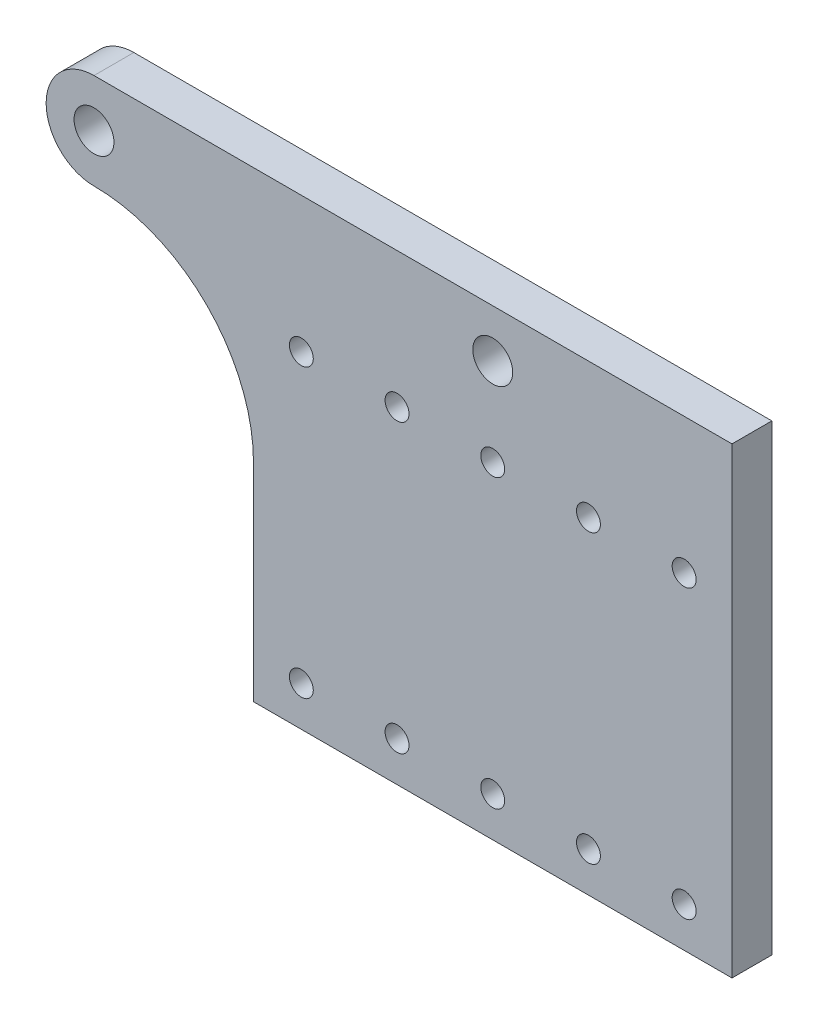
ISO-10303-21;
HEADER;
FILE_DESCRIPTION(('STEP AP214'),'2;1');
FILE_NAME('part.step','',(''),(''),'','','');
FILE_SCHEMA(('AUTOMOTIVE_DESIGN { 1 0 10303 214 1 1 1 1 }'));
ENDSEC;
DATA;
#1=APPLICATION_CONTEXT('core data for automotive mechanical design processes');
#2=APPLICATION_PROTOCOL_DEFINITION('international standard','automotive_design',2000,#1);
#3=PRODUCT_CONTEXT('',#1,'mechanical');
#4=PRODUCT('Part','Part','',(#3));
#5=PRODUCT_RELATED_PRODUCT_CATEGORY('part','',(#4));
#6=PRODUCT_DEFINITION_FORMATION('','',#4);
#7=PRODUCT_DEFINITION_CONTEXT('part definition',#1,'design');
#8=PRODUCT_DEFINITION('design','',#6,#7);
#9=PRODUCT_DEFINITION_SHAPE('','',#8);
#10=(LENGTH_UNIT() NAMED_UNIT(*) SI_UNIT(.MILLI.,.METRE.));
#11=(NAMED_UNIT(*) PLANE_ANGLE_UNIT() SI_UNIT($,.RADIAN.));
#12=(NAMED_UNIT(*) SI_UNIT($,.STERADIAN.) SOLID_ANGLE_UNIT());
#13=UNCERTAINTY_MEASURE_WITH_UNIT(LENGTH_MEASURE(1.E-05),#10,'distance_accuracy_value','');
#14=(GEOMETRIC_REPRESENTATION_CONTEXT(3) GLOBAL_UNCERTAINTY_ASSIGNED_CONTEXT((#13)) GLOBAL_UNIT_ASSIGNED_CONTEXT((#10,
#11,#12)) REPRESENTATION_CONTEXT('',''));
#15=CARTESIAN_POINT('',(0.,0.,0.));
#16=DIRECTION('',(0.,0.,1.));
#17=DIRECTION('',(1.,0.,0.));
#18=AXIS2_PLACEMENT_3D('',#15,#16,#17);
#19=CARTESIAN_POINT('',(24.,-41.,-0.00100000000000013));
#20=DIRECTION('',(0.,0.,1.));
#21=DIRECTION('',(1.,0.,0.));
#22=AXIS2_PLACEMENT_3D('',#19,#20,#21);
#23=CYLINDRICAL_SURFACE('',#22,1.5);
#24=CARTESIAN_POINT('',(24.,-41.,5.));
#25=DIRECTION('',(0.,0.,1.));
#26=DIRECTION('',(1.,0.,0.));
#27=AXIS2_PLACEMENT_3D('',#24,#25,#26);
#28=CIRCLE('',#27,1.5);
#29=CARTESIAN_POINT('',(25.5,-41.,5.));
#30=VERTEX_POINT('',#29);
#31=EDGE_CURVE('E169',#30,#30,#28,.T.);
#32=ORIENTED_EDGE('',*,*,#31,.T.);
#33=EDGE_LOOP('',(#32));
#34=FACE_BOUND('',#33,.T.);
#35=CARTESIAN_POINT('',(24.,-41.,0.));
#36=DIRECTION('',(0.,0.,1.));
#37=DIRECTION('',(1.,0.,0.));
#38=AXIS2_PLACEMENT_3D('',#35,#36,#37);
#39=CIRCLE('',#38,1.5);
#40=CARTESIAN_POINT('',(25.5,-41.,0.));
#41=VERTEX_POINT('',#40);
#42=EDGE_CURVE('E172',#41,#41,#39,.F.);
#43=ORIENTED_EDGE('',*,*,#42,.T.);
#44=EDGE_LOOP('',(#43));
#45=FACE_BOUND('',#44,.T.);
#46=ADVANCED_FACE('F38',(#34,#45),#23,.F.);
#47=CARTESIAN_POINT('',(12.,-41.,-0.00100000000000013));
#48=DIRECTION('',(0.,0.,1.));
#49=DIRECTION('',(1.,0.,0.));
#50=AXIS2_PLACEMENT_3D('',#47,#48,#49);
#51=CYLINDRICAL_SURFACE('',#50,1.5);
#52=CARTESIAN_POINT('',(12.,-41.,5.));
#53=DIRECTION('',(0.,0.,1.));
#54=DIRECTION('',(1.,0.,0.));
#55=AXIS2_PLACEMENT_3D('',#52,#53,#54);
#56=CIRCLE('',#55,1.5);
#57=CARTESIAN_POINT('',(13.5,-41.,5.));
#58=VERTEX_POINT('',#57);
#59=EDGE_CURVE('E163',#58,#58,#56,.T.);
#60=ORIENTED_EDGE('',*,*,#59,.T.);
#61=EDGE_LOOP('',(#60));
#62=FACE_BOUND('',#61,.T.);
#63=CARTESIAN_POINT('',(12.,-41.,0.));
#64=DIRECTION('',(0.,0.,1.));
#65=DIRECTION('',(1.,0.,0.));
#66=AXIS2_PLACEMENT_3D('',#63,#64,#65);
#67=CIRCLE('',#66,1.5);
#68=CARTESIAN_POINT('',(13.5,-41.,0.));
#69=VERTEX_POINT('',#68);
#70=EDGE_CURVE('E166',#69,#69,#67,.F.);
#71=ORIENTED_EDGE('',*,*,#70,.T.);
#72=EDGE_LOOP('',(#71));
#73=FACE_BOUND('',#72,.T.);
#74=ADVANCED_FACE('F203',(#62,#73),#51,.F.);
#75=CARTESIAN_POINT('',(0.,-41.,-0.00100000000000013));
#76=DIRECTION('',(0.,0.,1.));
#77=DIRECTION('',(1.,0.,0.));
#78=AXIS2_PLACEMENT_3D('',#75,#76,#77);
#79=CYLINDRICAL_SURFACE('',#78,1.5);
#80=CARTESIAN_POINT('',(0.,-41.,5.));
#81=DIRECTION('',(0.,0.,1.));
#82=DIRECTION('',(1.,0.,0.));
#83=AXIS2_PLACEMENT_3D('',#80,#81,#82);
#84=CIRCLE('',#83,1.5);
#85=CARTESIAN_POINT('',(1.49999999999999,-41.,5.));
#86=VERTEX_POINT('',#85);
#87=EDGE_CURVE('E157',#86,#86,#84,.T.);
#88=ORIENTED_EDGE('',*,*,#87,.T.);
#89=EDGE_LOOP('',(#88));
#90=FACE_BOUND('',#89,.T.);
#91=CARTESIAN_POINT('',(0.,-41.,0.));
#92=DIRECTION('',(0.,0.,1.));
#93=DIRECTION('',(1.,0.,0.));
#94=AXIS2_PLACEMENT_3D('',#91,#92,#93);
#95=CIRCLE('',#94,1.5);
#96=CARTESIAN_POINT('',(1.49999999999999,-41.,0.));
#97=VERTEX_POINT('',#96);
#98=EDGE_CURVE('E160',#97,#97,#95,.F.);
#99=ORIENTED_EDGE('',*,*,#98,.T.);
#100=EDGE_LOOP('',(#99));
#101=FACE_BOUND('',#100,.T.);
#102=ADVANCED_FACE('F208',(#90,#101),#79,.F.);
#103=CARTESIAN_POINT('',(24.,-5.,-0.00100000000000013));
#104=DIRECTION('',(0.,0.,1.));
#105=DIRECTION('',(1.,0.,0.));
#106=AXIS2_PLACEMENT_3D('',#103,#104,#105);
#107=CYLINDRICAL_SURFACE('',#106,1.5);
#108=CARTESIAN_POINT('',(24.,-5.,5.));
#109=DIRECTION('',(0.,0.,1.));
#110=DIRECTION('',(1.,0.,0.));
#111=AXIS2_PLACEMENT_3D('',#108,#109,#110);
#112=CIRCLE('',#111,1.5);
#113=CARTESIAN_POINT('',(25.5,-5.,5.));
#114=VERTEX_POINT('',#113);
#115=EDGE_CURVE('E151',#114,#114,#112,.T.);
#116=ORIENTED_EDGE('',*,*,#115,.T.);
#117=EDGE_LOOP('',(#116));
#118=FACE_BOUND('',#117,.T.);
#119=CARTESIAN_POINT('',(24.,-5.,0.));
#120=DIRECTION('',(0.,0.,1.));
#121=DIRECTION('',(1.,0.,0.));
#122=AXIS2_PLACEMENT_3D('',#119,#120,#121);
#123=CIRCLE('',#122,1.5);
#124=CARTESIAN_POINT('',(25.5,-5.,0.));
#125=VERTEX_POINT('',#124);
#126=EDGE_CURVE('E154',#125,#125,#123,.F.);
#127=ORIENTED_EDGE('',*,*,#126,.T.);
#128=EDGE_LOOP('',(#127));
#129=FACE_BOUND('',#128,.T.);
#130=ADVANCED_FACE('F215',(#118,#129),#107,.F.);
#131=CARTESIAN_POINT('',(12.,-5.,-0.00100000000000013));
#132=DIRECTION('',(0.,0.,1.));
#133=DIRECTION('',(1.,0.,0.));
#134=AXIS2_PLACEMENT_3D('',#131,#132,#133);
#135=CYLINDRICAL_SURFACE('',#134,1.5);
#136=CARTESIAN_POINT('',(12.,-5.,5.));
#137=DIRECTION('',(0.,0.,1.));
#138=DIRECTION('',(1.,0.,0.));
#139=AXIS2_PLACEMENT_3D('',#136,#137,#138);
#140=CIRCLE('',#139,1.5);
#141=CARTESIAN_POINT('',(13.5,-5.,5.));
#142=VERTEX_POINT('',#141);
#143=EDGE_CURVE('E145',#142,#142,#140,.T.);
#144=ORIENTED_EDGE('',*,*,#143,.T.);
#145=EDGE_LOOP('',(#144));
#146=FACE_BOUND('',#145,.T.);
#147=CARTESIAN_POINT('',(12.,-5.,0.));
#148=DIRECTION('',(0.,0.,1.));
#149=DIRECTION('',(1.,0.,0.));
#150=AXIS2_PLACEMENT_3D('',#147,#148,#149);
#151=CIRCLE('',#150,1.5);
#152=CARTESIAN_POINT('',(13.5,-5.,0.));
#153=VERTEX_POINT('',#152);
#154=EDGE_CURVE('E148',#153,#153,#151,.F.);
#155=ORIENTED_EDGE('',*,*,#154,.T.);
#156=EDGE_LOOP('',(#155));
#157=FACE_BOUND('',#156,.T.);
#158=ADVANCED_FACE('F219',(#146,#157),#135,.F.);
#159=CARTESIAN_POINT('',(0.,-5.,-0.00100000000000013));
#160=DIRECTION('',(0.,0.,1.));
#161=DIRECTION('',(1.,0.,0.));
#162=AXIS2_PLACEMENT_3D('',#159,#160,#161);
#163=CYLINDRICAL_SURFACE('',#162,1.5);
#164=CARTESIAN_POINT('',(0.,-5.,5.));
#165=DIRECTION('',(0.,0.,1.));
#166=DIRECTION('',(1.,0.,0.));
#167=AXIS2_PLACEMENT_3D('',#164,#165,#166);
#168=CIRCLE('',#167,1.5);
#169=CARTESIAN_POINT('',(1.49999999999999,-5.,5.));
#170=VERTEX_POINT('',#169);
#171=EDGE_CURVE('E107',#170,#170,#168,.T.);
#172=ORIENTED_EDGE('',*,*,#171,.T.);
#173=EDGE_LOOP('',(#172));
#174=FACE_BOUND('',#173,.T.);
#175=CARTESIAN_POINT('',(0.,-5.,0.));
#176=DIRECTION('',(0.,0.,1.));
#177=DIRECTION('',(1.,0.,0.));
#178=AXIS2_PLACEMENT_3D('',#175,#176,#177);
#179=CIRCLE('',#178,1.5);
#180=CARTESIAN_POINT('',(1.49999999999999,-5.,0.));
#181=VERTEX_POINT('',#180);
#182=EDGE_CURVE('E142',#181,#181,#179,.F.);
#183=ORIENTED_EDGE('',*,*,#182,.T.);
#184=EDGE_LOOP('',(#183));
#185=FACE_BOUND('',#184,.T.);
#186=ADVANCED_FACE('F223',(#174,#185),#163,.F.);
#187=CARTESIAN_POINT('',(-50.,6.,5.));
#188=DIRECTION('',(0.,0.,1.));
#189=DIRECTION('',(1.,0.,0.));
#190=AXIS2_PLACEMENT_3D('',#187,#188,#189);
#191=PLANE('',#190);
#192=CARTESIAN_POINT('',(-12.,-41.,5.));
#193=DIRECTION('',(0.,0.,1.));
#194=DIRECTION('',(1.,0.,0.));
#195=AXIS2_PLACEMENT_3D('',#192,#193,#194);
#196=CIRCLE('',#195,1.5);
#197=CARTESIAN_POINT('',(-10.5,-41.,5.));
#198=VERTEX_POINT('',#197);
#199=EDGE_CURVE('E379',#198,#198,#196,.T.);
#200=ORIENTED_EDGE('',*,*,#199,.F.);
#201=EDGE_LOOP('',(#200));
#202=FACE_BOUND('',#201,.T.);
#203=CARTESIAN_POINT('',(-12.,-5.,5.));
#204=DIRECTION('',(0.,0.,1.));
#205=DIRECTION('',(1.,0.,0.));
#206=AXIS2_PLACEMENT_3D('',#203,#204,#205);
#207=CIRCLE('',#206,1.5);
#208=CARTESIAN_POINT('',(-10.5,-5.,5.));
#209=VERTEX_POINT('',#208);
#210=EDGE_CURVE('E383',#209,#209,#207,.T.);
#211=ORIENTED_EDGE('',*,*,#210,.F.);
#212=EDGE_LOOP('',(#211));
#213=FACE_BOUND('',#212,.T.);
#214=CARTESIAN_POINT('',(-24.,-5.,5.));
#215=DIRECTION('',(0.,0.,1.));
#216=DIRECTION('',(1.,0.,0.));
#217=AXIS2_PLACEMENT_3D('',#214,#215,#216);
#218=CIRCLE('',#217,1.5);
#219=CARTESIAN_POINT('',(-22.5,-5.,5.));
#220=VERTEX_POINT('',#219);
#221=EDGE_CURVE('E387',#220,#220,#218,.T.);
#222=ORIENTED_EDGE('',*,*,#221,.F.);
#223=EDGE_LOOP('',(#222));
#224=FACE_BOUND('',#223,.T.);
#225=CARTESIAN_POINT('',(-24.,-41.,5.));
#226=DIRECTION('',(0.,0.,1.));
#227=DIRECTION('',(1.,0.,0.));
#228=AXIS2_PLACEMENT_3D('',#225,#226,#227);
#229=CIRCLE('',#228,1.5);
#230=CARTESIAN_POINT('',(-22.5,-41.,5.));
#231=VERTEX_POINT('',#230);
#232=EDGE_CURVE('E391',#231,#231,#229,.T.);
#233=ORIENTED_EDGE('',*,*,#232,.F.);
#234=EDGE_LOOP('',(#233));
#235=FACE_BOUND('',#234,.T.);
#236=CARTESIAN_POINT('',(-50.,6.,5.));
#237=DIRECTION('',(0.,0.,1.));
#238=DIRECTION('',(1.,0.,0.));
#239=AXIS2_PLACEMENT_3D('',#236,#237,#238);
#240=CIRCLE('',#239,2.50000000000002);
#241=CARTESIAN_POINT('',(-47.5,6.,5.));
#242=VERTEX_POINT('',#241);
#243=EDGE_CURVE('E124',#242,#242,#240,.T.);
#244=ORIENTED_EDGE('',*,*,#243,.F.);
#245=EDGE_LOOP('',(#244));
#246=FACE_BOUND('',#245,.T.);
#247=DIRECTION('',(0.,1.,0.));
#248=VECTOR('',#247,1.);
#249=CARTESIAN_POINT('',(30.,0.,5.));
#250=LINE('',#249,#248);
#251=CARTESIAN_POINT('',(30.,-46.,5.));
#252=VERTEX_POINT('',#251);
#253=CARTESIAN_POINT('',(30.,12.,5.));
#254=VERTEX_POINT('',#253);
#255=EDGE_CURVE('E87',#252,#254,#250,.T.);
#256=ORIENTED_EDGE('',*,*,#255,.T.);
#257=DIRECTION('',(-1.,0.,0.));
#258=VECTOR('',#257,1.);
#259=CARTESIAN_POINT('',(-50.,12.,5.));
#260=LINE('',#259,#258);
#261=CARTESIAN_POINT('',(-50.,12.,5.));
#262=VERTEX_POINT('',#261);
#263=EDGE_CURVE('E92',#254,#262,#260,.T.);
#264=ORIENTED_EDGE('',*,*,#263,.T.);
#265=CARTESIAN_POINT('',(-50.,6.,5.));
#266=DIRECTION('',(0.,0.,1.));
#267=DIRECTION('',(1.,0.,0.));
#268=AXIS2_PLACEMENT_3D('',#265,#266,#267);
#269=CIRCLE('',#268,6.);
#270=CARTESIAN_POINT('',(-50.,0.,5.));
#271=VERTEX_POINT('',#270);
#272=EDGE_CURVE('E113',#262,#271,#269,.T.);
#273=ORIENTED_EDGE('',*,*,#272,.T.);
#274=CARTESIAN_POINT('',(-50.,-20.,5.));
#275=DIRECTION('',(0.,0.,1.));
#276=DIRECTION('',(1.,0.,0.));
#277=AXIS2_PLACEMENT_3D('',#274,#275,#276);
#278=CIRCLE('',#277,20.);
#279=CARTESIAN_POINT('',(-30.,-20.,5.));
#280=VERTEX_POINT('',#279);
#281=EDGE_CURVE('E11',#271,#280,#278,.F.);
#282=ORIENTED_EDGE('',*,*,#281,.T.);
#283=DIRECTION('',(0.,-1.,0.));
#284=VECTOR('',#283,1.);
#285=CARTESIAN_POINT('',(-30.,0.,5.));
#286=LINE('',#285,#284);
#287=CARTESIAN_POINT('',(-30.,-46.,5.));
#288=VERTEX_POINT('',#287);
#289=EDGE_CURVE('E115',#280,#288,#286,.T.);
#290=ORIENTED_EDGE('',*,*,#289,.T.);
#291=DIRECTION('',(1.,0.,0.));
#292=VECTOR('',#291,1.);
#293=CARTESIAN_POINT('',(-30.,-46.,5.));
#294=LINE('',#293,#292);
#295=EDGE_CURVE('E95',#288,#252,#294,.T.);
#296=ORIENTED_EDGE('',*,*,#295,.T.);
#297=EDGE_LOOP('',(#256,#264,#273,#282,#290,#296));
#298=FACE_BOUND('',#297,.T.);
#299=CARTESIAN_POINT('',(0.,6.,5.));
#300=DIRECTION('',(0.,0.,1.));
#301=DIRECTION('',(1.,0.,0.));
#302=AXIS2_PLACEMENT_3D('',#299,#300,#301);
#303=CIRCLE('',#302,2.5);
#304=CARTESIAN_POINT('',(2.5,6.,5.));
#305=VERTEX_POINT('',#304);
#306=EDGE_CURVE('E397',#305,#305,#303,.T.);
#307=ORIENTED_EDGE('',*,*,#306,.F.);
#308=EDGE_LOOP('',(#307));
#309=FACE_BOUND('',#308,.T.);
#310=ORIENTED_EDGE('',*,*,#171,.F.);
#311=EDGE_LOOP('',(#310));
#312=FACE_BOUND('',#311,.T.);
#313=ORIENTED_EDGE('',*,*,#143,.F.);
#314=EDGE_LOOP('',(#313));
#315=FACE_BOUND('',#314,.T.);
#316=ORIENTED_EDGE('',*,*,#115,.F.);
#317=EDGE_LOOP('',(#316));
#318=FACE_BOUND('',#317,.T.);
#319=ORIENTED_EDGE('',*,*,#87,.F.);
#320=EDGE_LOOP('',(#319));
#321=FACE_BOUND('',#320,.T.);
#322=ORIENTED_EDGE('',*,*,#59,.F.);
#323=EDGE_LOOP('',(#322));
#324=FACE_BOUND('',#323,.T.);
#325=ORIENTED_EDGE('',*,*,#31,.F.);
#326=EDGE_LOOP('',(#325));
#327=FACE_BOUND('',#326,.T.);
#328=ADVANCED_FACE('F89',(#202,#213,#224,#235,#246,#298,#309,#312,#315,#318,#321,#324,#327),
#191,.T.);
#329=CARTESIAN_POINT('',(-50.,6.,0.));
#330=DIRECTION('',(0.,0.,1.));
#331=DIRECTION('',(1.,0.,0.));
#332=AXIS2_PLACEMENT_3D('',#329,#330,#331);
#333=PLANE('',#332);
#334=CARTESIAN_POINT('',(-12.,-41.,0.));
#335=DIRECTION('',(0.,0.,1.));
#336=DIRECTION('',(1.,0.,0.));
#337=AXIS2_PLACEMENT_3D('',#334,#335,#336);
#338=CIRCLE('',#337,1.5);
#339=CARTESIAN_POINT('',(-10.5,-41.,0.));
#340=VERTEX_POINT('',#339);
#341=EDGE_CURVE('E416',#340,#340,#338,.F.);
#342=ORIENTED_EDGE('',*,*,#341,.F.);
#343=EDGE_LOOP('',(#342));
#344=FACE_BOUND('',#343,.T.);
#345=CARTESIAN_POINT('',(-12.,-5.,0.));
#346=DIRECTION('',(0.,0.,1.));
#347=DIRECTION('',(1.,0.,0.));
#348=AXIS2_PLACEMENT_3D('',#345,#346,#347);
#349=CIRCLE('',#348,1.5);
#350=CARTESIAN_POINT('',(-10.5,-5.,0.));
#351=VERTEX_POINT('',#350);
#352=EDGE_CURVE('E409',#351,#351,#349,.F.);
#353=ORIENTED_EDGE('',*,*,#352,.F.);
#354=EDGE_LOOP('',(#353));
#355=FACE_BOUND('',#354,.T.);
#356=CARTESIAN_POINT('',(-24.,-5.,0.));
#357=DIRECTION('',(0.,0.,1.));
#358=DIRECTION('',(1.,0.,0.));
#359=AXIS2_PLACEMENT_3D('',#356,#357,#358);
#360=CIRCLE('',#359,1.5);
#361=CARTESIAN_POINT('',(-22.5,-5.,0.));
#362=VERTEX_POINT('',#361);
#363=EDGE_CURVE('E402',#362,#362,#360,.F.);
#364=ORIENTED_EDGE('',*,*,#363,.F.);
#365=EDGE_LOOP('',(#364));
#366=FACE_BOUND('',#365,.T.);
#367=CARTESIAN_POINT('',(-24.,-41.,0.));
#368=DIRECTION('',(0.,0.,1.));
#369=DIRECTION('',(1.,0.,0.));
#370=AXIS2_PLACEMENT_3D('',#367,#368,#369);
#371=CIRCLE('',#370,1.5);
#372=CARTESIAN_POINT('',(-22.5,-41.,0.));
#373=VERTEX_POINT('',#372);
#374=EDGE_CURVE('E405',#373,#373,#371,.F.);
#375=ORIENTED_EDGE('',*,*,#374,.F.);
#376=EDGE_LOOP('',(#375));
#377=FACE_BOUND('',#376,.T.);
#378=DIRECTION('',(0.,1.,0.));
#379=VECTOR('',#378,1.);
#380=CARTESIAN_POINT('',(30.,12.,0.));
#381=LINE('',#380,#379);
#382=CARTESIAN_POINT('',(30.,-46.,0.));
#383=VERTEX_POINT('',#382);
#384=CARTESIAN_POINT('',(30.,12.,0.));
#385=VERTEX_POINT('',#384);
#386=EDGE_CURVE('E104',#383,#385,#381,.T.);
#387=ORIENTED_EDGE('',*,*,#386,.F.);
#388=DIRECTION('',(1.,0.,0.));
#389=VECTOR('',#388,1.);
#390=CARTESIAN_POINT('',(-30.,-46.,0.));
#391=LINE('',#390,#389);
#392=CARTESIAN_POINT('',(-30.,-46.,0.));
#393=VERTEX_POINT('',#392);
#394=EDGE_CURVE('E99',#393,#383,#391,.T.);
#395=ORIENTED_EDGE('',*,*,#394,.F.);
#396=DIRECTION('',(0.,-1.,0.));
#397=VECTOR('',#396,1.);
#398=CARTESIAN_POINT('',(-30.,0.,0.));
#399=LINE('',#398,#397);
#400=CARTESIAN_POINT('',(-30.,-20.,0.));
#401=VERTEX_POINT('',#400);
#402=EDGE_CURVE('E129',#401,#393,#399,.T.);
#403=ORIENTED_EDGE('',*,*,#402,.F.);
#404=CARTESIAN_POINT('',(-50.,-20.,0.));
#405=DIRECTION('',(0.,0.,1.));
#406=DIRECTION('',(1.,0.,0.));
#407=AXIS2_PLACEMENT_3D('',#404,#405,#406);
#408=CIRCLE('',#407,20.);
#409=CARTESIAN_POINT('',(-50.,0.,0.));
#410=VERTEX_POINT('',#409);
#411=EDGE_CURVE('E46',#401,#410,#408,.T.);
#412=ORIENTED_EDGE('',*,*,#411,.T.);
#413=CARTESIAN_POINT('',(-50.,6.,0.));
#414=DIRECTION('',(0.,0.,1.));
#415=DIRECTION('',(1.,0.,0.));
#416=AXIS2_PLACEMENT_3D('',#413,#414,#415);
#417=CIRCLE('',#416,6.);
#418=CARTESIAN_POINT('',(-50.,12.,0.));
#419=VERTEX_POINT('',#418);
#420=EDGE_CURVE('E126',#419,#410,#417,.T.);
#421=ORIENTED_EDGE('',*,*,#420,.F.);
#422=DIRECTION('',(-1.,0.,0.));
#423=VECTOR('',#422,1.);
#424=CARTESIAN_POINT('',(-50.,12.,0.));
#425=LINE('',#424,#423);
#426=EDGE_CURVE('E123',#385,#419,#425,.T.);
#427=ORIENTED_EDGE('',*,*,#426,.F.);
#428=EDGE_LOOP('',(#387,#395,#403,#412,#421,#427));
#429=FACE_BOUND('',#428,.T.);
#430=CARTESIAN_POINT('',(-50.,6.,0.));
#431=DIRECTION('',(0.,0.,1.));
#432=DIRECTION('',(1.,0.,0.));
#433=AXIS2_PLACEMENT_3D('',#430,#431,#432);
#434=CIRCLE('',#433,2.50000000000002);
#435=CARTESIAN_POINT('',(-47.5,6.,0.));
#436=VERTEX_POINT('',#435);
#437=EDGE_CURVE('E394',#436,#436,#434,.T.);
#438=ORIENTED_EDGE('',*,*,#437,.T.);
#439=EDGE_LOOP('',(#438));
#440=FACE_BOUND('',#439,.T.);
#441=CARTESIAN_POINT('',(0.,6.,0.));
#442=DIRECTION('',(0.,0.,1.));
#443=DIRECTION('',(1.,0.,0.));
#444=AXIS2_PLACEMENT_3D('',#441,#442,#443);
#445=CIRCLE('',#444,2.5);
#446=CARTESIAN_POINT('',(2.5,6.,0.));
#447=VERTEX_POINT('',#446);
#448=EDGE_CURVE('E399',#447,#447,#445,.T.);
#449=ORIENTED_EDGE('',*,*,#448,.T.);
#450=EDGE_LOOP('',(#449));
#451=FACE_BOUND('',#450,.T.);
#452=ORIENTED_EDGE('',*,*,#182,.F.);
#453=EDGE_LOOP('',(#452));
#454=FACE_BOUND('',#453,.T.);
#455=ORIENTED_EDGE('',*,*,#154,.F.);
#456=EDGE_LOOP('',(#455));
#457=FACE_BOUND('',#456,.T.);
#458=ORIENTED_EDGE('',*,*,#126,.F.);
#459=EDGE_LOOP('',(#458));
#460=FACE_BOUND('',#459,.T.);
#461=ORIENTED_EDGE('',*,*,#98,.F.);
#462=EDGE_LOOP('',(#461));
#463=FACE_BOUND('',#462,.T.);
#464=ORIENTED_EDGE('',*,*,#70,.F.);
#465=EDGE_LOOP('',(#464));
#466=FACE_BOUND('',#465,.T.);
#467=ORIENTED_EDGE('',*,*,#42,.F.);
#468=EDGE_LOOP('',(#467));
#469=FACE_BOUND('',#468,.T.);
#470=ADVANCED_FACE('F179',(#344,#355,#366,#377,#429,#440,#451,#454,#457,#460,#463,#466,#469),
#333,.F.);
#471=CARTESIAN_POINT('',(30.,12.,5.));
#472=DIRECTION('',(-1.,0.,0.));
#473=DIRECTION('',(0.,-1.,0.));
#474=AXIS2_PLACEMENT_3D('',#471,#472,#473);
#475=PLANE('',#474);
#476=ORIENTED_EDGE('',*,*,#386,.T.);
#477=DIRECTION('',(0.,0.,-1.));
#478=VECTOR('',#477,1.);
#479=CARTESIAN_POINT('',(30.,12.,5.));
#480=LINE('',#479,#478);
#481=EDGE_CURVE('E102',#254,#385,#480,.T.);
#482=ORIENTED_EDGE('',*,*,#481,.F.);
#483=ORIENTED_EDGE('',*,*,#255,.F.);
#484=DIRECTION('',(0.,0.,-1.));
#485=VECTOR('',#484,1.);
#486=CARTESIAN_POINT('',(30.,-46.,5.));
#487=LINE('',#486,#485);
#488=EDGE_CURVE('E121',#252,#383,#487,.T.);
#489=ORIENTED_EDGE('',*,*,#488,.T.);
#490=EDGE_LOOP('',(#476,#482,#483,#489));
#491=FACE_BOUND('',#490,.T.);
#492=ADVANCED_FACE('F103',(#491),#475,.F.);
#493=CARTESIAN_POINT('',(-50.,12.,5.));
#494=DIRECTION('',(0.,-1.,0.));
#495=DIRECTION('',(1.,0.,0.));
#496=AXIS2_PLACEMENT_3D('',#493,#494,#495);
#497=PLANE('',#496);
#498=ORIENTED_EDGE('',*,*,#426,.T.);
#499=DIRECTION('',(0.,0.,-1.));
#500=VECTOR('',#499,1.);
#501=CARTESIAN_POINT('',(-50.,12.,5.));
#502=LINE('',#501,#500);
#503=EDGE_CURVE('E108',#262,#419,#502,.T.);
#504=ORIENTED_EDGE('',*,*,#503,.F.);
#505=ORIENTED_EDGE('',*,*,#263,.F.);
#506=ORIENTED_EDGE('',*,*,#481,.T.);
#507=EDGE_LOOP('',(#498,#504,#505,#506));
#508=FACE_BOUND('',#507,.T.);
#509=ADVANCED_FACE('F110',(#508),#497,.F.);
#510=CARTESIAN_POINT('',(-50.,6.,5.));
#511=DIRECTION('',(0.,0.,-1.));
#512=DIRECTION('',(-1.,0.,0.));
#513=AXIS2_PLACEMENT_3D('',#510,#511,#512);
#514=CYLINDRICAL_SURFACE('',#513,6.);
#515=ORIENTED_EDGE('',*,*,#420,.T.);
#516=DIRECTION('',(0.,0.,-1.));
#517=VECTOR('',#516,1.);
#518=CARTESIAN_POINT('',(-50.,0.,5.));
#519=LINE('',#518,#517);
#520=EDGE_CURVE('E137',#271,#410,#519,.T.);
#521=ORIENTED_EDGE('',*,*,#520,.F.);
#522=ORIENTED_EDGE('',*,*,#272,.F.);
#523=ORIENTED_EDGE('',*,*,#503,.T.);
#524=EDGE_LOOP('',(#515,#521,#522,#523));
#525=FACE_BOUND('',#524,.T.);
#526=ADVANCED_FACE('F184',(#525),#514,.T.);
#527=CARTESIAN_POINT('',(-30.,0.,5.));
#528=DIRECTION('',(1.,0.,0.));
#529=DIRECTION('',(0.,1.,0.));
#530=AXIS2_PLACEMENT_3D('',#527,#528,#529);
#531=PLANE('',#530);
#532=ORIENTED_EDGE('',*,*,#289,.F.);
#533=DIRECTION('',(0.,0.,-1.));
#534=VECTOR('',#533,1.);
#535=CARTESIAN_POINT('',(-30.,-20.,0.));
#536=LINE('',#535,#534);
#537=EDGE_CURVE('E175',#280,#401,#536,.T.);
#538=ORIENTED_EDGE('',*,*,#537,.T.);
#539=ORIENTED_EDGE('',*,*,#402,.T.);
#540=DIRECTION('',(0.,0.,-1.));
#541=VECTOR('',#540,1.);
#542=CARTESIAN_POINT('',(-30.,-46.,5.));
#543=LINE('',#542,#541);
#544=EDGE_CURVE('E134',#288,#393,#543,.T.);
#545=ORIENTED_EDGE('',*,*,#544,.F.);
#546=EDGE_LOOP('',(#532,#538,#539,#545));
#547=FACE_BOUND('',#546,.T.);
#548=ADVANCED_FACE('F186',(#547),#531,.F.);
#549=CARTESIAN_POINT('',(-30.,-46.,5.));
#550=DIRECTION('',(0.,1.,0.));
#551=DIRECTION('',(0.,0.,1.));
#552=AXIS2_PLACEMENT_3D('',#549,#550,#551);
#553=PLANE('',#552);
#554=ORIENTED_EDGE('',*,*,#394,.T.);
#555=ORIENTED_EDGE('',*,*,#488,.F.);
#556=ORIENTED_EDGE('',*,*,#295,.F.);
#557=ORIENTED_EDGE('',*,*,#544,.T.);
#558=EDGE_LOOP('',(#554,#555,#556,#557));
#559=FACE_BOUND('',#558,.T.);
#560=ADVANCED_FACE('F189',(#559),#553,.F.);
#561=CARTESIAN_POINT('',(-50.,6.,5.));
#562=DIRECTION('',(0.,0.,-1.));
#563=DIRECTION('',(-1.,0.,0.));
#564=AXIS2_PLACEMENT_3D('',#561,#562,#563);
#565=CYLINDRICAL_SURFACE('',#564,2.50000000000002);
#566=ORIENTED_EDGE('',*,*,#243,.T.);
#567=EDGE_LOOP('',(#566));
#568=FACE_BOUND('',#567,.T.);
#569=ORIENTED_EDGE('',*,*,#437,.F.);
#570=EDGE_LOOP('',(#569));
#571=FACE_BOUND('',#570,.T.);
#572=ADVANCED_FACE('F191',(#568,#571),#565,.F.);
#573=CARTESIAN_POINT('',(0.,6.,5.));
#574=DIRECTION('',(0.,0.,-1.));
#575=DIRECTION('',(-1.,0.,0.));
#576=AXIS2_PLACEMENT_3D('',#573,#574,#575);
#577=CYLINDRICAL_SURFACE('',#576,2.5);
#578=ORIENTED_EDGE('',*,*,#306,.T.);
#579=EDGE_LOOP('',(#578));
#580=FACE_BOUND('',#579,.T.);
#581=ORIENTED_EDGE('',*,*,#448,.F.);
#582=EDGE_LOOP('',(#581));
#583=FACE_BOUND('',#582,.T.);
#584=ADVANCED_FACE('F197',(#580,#583),#577,.F.);
#585=CARTESIAN_POINT('',(-24.,-41.,-0.00100000000000013));
#586=DIRECTION('',(0.,0.,1.));
#587=DIRECTION('',(1.,0.,0.));
#588=AXIS2_PLACEMENT_3D('',#585,#586,#587);
#589=CYLINDRICAL_SURFACE('',#588,1.5);
#590=ORIENTED_EDGE('',*,*,#232,.T.);
#591=EDGE_LOOP('',(#590));
#592=FACE_BOUND('',#591,.T.);
#593=ORIENTED_EDGE('',*,*,#374,.T.);
#594=EDGE_LOOP('',(#593));
#595=FACE_BOUND('',#594,.T.);
#596=ADVANCED_FACE('F277',(#592,#595),#589,.F.);
#597=CARTESIAN_POINT('',(-24.,-5.,-0.00100000000000013));
#598=DIRECTION('',(0.,0.,1.));
#599=DIRECTION('',(1.,0.,0.));
#600=AXIS2_PLACEMENT_3D('',#597,#598,#599);
#601=CYLINDRICAL_SURFACE('',#600,1.5);
#602=ORIENTED_EDGE('',*,*,#221,.T.);
#603=EDGE_LOOP('',(#602));
#604=FACE_BOUND('',#603,.T.);
#605=ORIENTED_EDGE('',*,*,#363,.T.);
#606=EDGE_LOOP('',(#605));
#607=FACE_BOUND('',#606,.T.);
#608=ADVANCED_FACE('F268',(#604,#607),#601,.F.);
#609=CARTESIAN_POINT('',(-12.,-5.,-0.00100000000000013));
#610=DIRECTION('',(0.,0.,1.));
#611=DIRECTION('',(1.,0.,0.));
#612=AXIS2_PLACEMENT_3D('',#609,#610,#611);
#613=CYLINDRICAL_SURFACE('',#612,1.5);
#614=ORIENTED_EDGE('',*,*,#210,.T.);
#615=EDGE_LOOP('',(#614));
#616=FACE_BOUND('',#615,.T.);
#617=ORIENTED_EDGE('',*,*,#352,.T.);
#618=EDGE_LOOP('',(#617));
#619=FACE_BOUND('',#618,.T.);
#620=ADVANCED_FACE('F260',(#616,#619),#613,.F.);
#621=CARTESIAN_POINT('',(-12.,-41.,-0.00100000000000013));
#622=DIRECTION('',(0.,0.,1.));
#623=DIRECTION('',(1.,0.,0.));
#624=AXIS2_PLACEMENT_3D('',#621,#622,#623);
#625=CYLINDRICAL_SURFACE('',#624,1.5);
#626=ORIENTED_EDGE('',*,*,#199,.T.);
#627=EDGE_LOOP('',(#626));
#628=FACE_BOUND('',#627,.T.);
#629=ORIENTED_EDGE('',*,*,#341,.T.);
#630=EDGE_LOOP('',(#629));
#631=FACE_BOUND('',#630,.T.);
#632=ADVANCED_FACE('F251',(#628,#631),#625,.F.);
#633=CARTESIAN_POINT('',(-50.,-20.,5.));
#634=DIRECTION('',(0.,0.,1.));
#635=DIRECTION('',(1.,0.,0.));
#636=AXIS2_PLACEMENT_3D('',#633,#634,#635);
#637=CYLINDRICAL_SURFACE('',#636,20.);
#638=ORIENTED_EDGE('',*,*,#281,.F.);
#639=ORIENTED_EDGE('',*,*,#520,.T.);
#640=ORIENTED_EDGE('',*,*,#411,.F.);
#641=ORIENTED_EDGE('',*,*,#537,.F.);
#642=EDGE_LOOP('',(#638,#639,#640,#641));
#643=FACE_BOUND('',#642,.T.);
#644=ADVANCED_FACE('F40',(#643),#637,.F.);
#645=CLOSED_SHELL('',(#46,#74,#102,#130,#158,#186,#328,#470,#492,#509,#526,#548,#560,#572,#584,
#596,#608,#620,#632,#644));
#646=MANIFOLD_SOLID_BREP('B2',#645);
#647=ADVANCED_BREP_SHAPE_REPRESENTATION('',(#18,#646),#14);
#648=SHAPE_DEFINITION_REPRESENTATION(#9,#647);
ENDSEC;
END-ISO-10303-21;
